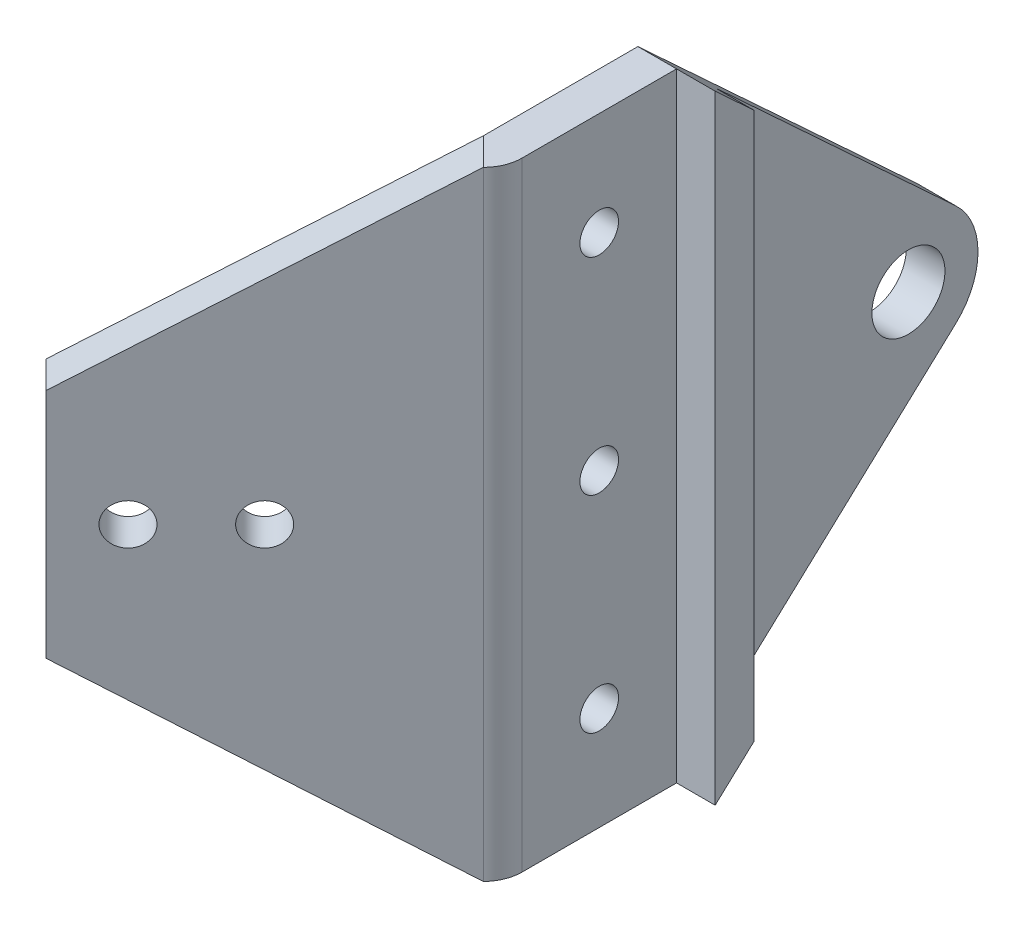
ISO-10303-21;
HEADER;
FILE_DESCRIPTION(('STEP AP214'),'2;1');
FILE_NAME('part.step','',(''),(''),'','','');
FILE_SCHEMA(('AUTOMOTIVE_DESIGN { 1 0 10303 214 1 1 1 1 }'));
ENDSEC;
DATA;
#1=APPLICATION_CONTEXT('core data for automotive mechanical design processes');
#2=APPLICATION_PROTOCOL_DEFINITION('international standard','automotive_design',2000,#1);
#3=PRODUCT_CONTEXT('',#1,'mechanical');
#4=PRODUCT('Part','Part','',(#3));
#5=PRODUCT_RELATED_PRODUCT_CATEGORY('part','',(#4));
#6=PRODUCT_DEFINITION_FORMATION('','',#4);
#7=PRODUCT_DEFINITION_CONTEXT('part definition',#1,'design');
#8=PRODUCT_DEFINITION('design','',#6,#7);
#9=PRODUCT_DEFINITION_SHAPE('','',#8);
#10=(LENGTH_UNIT() NAMED_UNIT(*) SI_UNIT(.MILLI.,.METRE.));
#11=(NAMED_UNIT(*) PLANE_ANGLE_UNIT() SI_UNIT($,.RADIAN.));
#12=(NAMED_UNIT(*) SI_UNIT($,.STERADIAN.) SOLID_ANGLE_UNIT());
#13=UNCERTAINTY_MEASURE_WITH_UNIT(LENGTH_MEASURE(1.E-05),#10,'distance_accuracy_value','');
#14=(GEOMETRIC_REPRESENTATION_CONTEXT(3) GLOBAL_UNCERTAINTY_ASSIGNED_CONTEXT((#13)) GLOBAL_UNIT_ASSIGNED_CONTEXT((#10,
#11,#12)) REPRESENTATION_CONTEXT('',''));
#15=CARTESIAN_POINT('',(0.,0.,0.));
#16=DIRECTION('',(0.,0.,1.));
#17=DIRECTION('',(1.,0.,0.));
#18=AXIS2_PLACEMENT_3D('',#15,#16,#17);
#19=CARTESIAN_POINT('',(6.35,45.6964355111143,0.));
#20=DIRECTION('',(0.,1.,0.));
#21=DIRECTION('',(0.,0.,1.));
#22=AXIS2_PLACEMENT_3D('',#19,#20,#21);
#23=PLANE('',#22);
#24=DIRECTION('',(-0.70710678118655,0.,-0.707106781186545));
#25=VECTOR('',#24,1.);
#26=CARTESIAN_POINT('',(26.5555762724059,45.6964355111151,-1304.32184699191));
#27=LINE('',#26,#25);
#28=CARTESIAN_POINT('',(4.49012806053468,45.6964355111151,-1326.38729520378));
#29=VERTEX_POINT('',#28);
#30=CARTESIAN_POINT('',(8.53483950180589E-13,45.6964355111151,-1330.87742326432));
#31=VERTEX_POINT('',#30);
#32=EDGE_CURVE('E364',#29,#31,#27,.T.);
#33=ORIENTED_EDGE('',*,*,#32,.T.);
#34=DIRECTION('',(0.,0.,-1.));
#35=VECTOR('',#34,1.);
#36=CARTESIAN_POINT('',(0.,45.6964355111143,0.));
#37=LINE('',#36,#35);
#38=CARTESIAN_POINT('',(0.,45.6964355111151,-1356.27742326432));
#39=VERTEX_POINT('',#38);
#40=EDGE_CURVE('E289',#31,#39,#37,.T.);
#41=ORIENTED_EDGE('',*,*,#40,.T.);
#42=DIRECTION('',(-1.,0.,0.));
#43=VECTOR('',#42,1.);
#44=CARTESIAN_POINT('',(6.35,45.6964355111151,-1356.27742326432));
#45=LINE('',#44,#43);
#46=CARTESIAN_POINT('',(6.35,45.6964355111151,-1356.27742326432));
#47=VERTEX_POINT('',#46);
#48=EDGE_CURVE('E280',#47,#39,#45,.T.);
#49=ORIENTED_EDGE('',*,*,#48,.F.);
#50=DIRECTION('',(0.,0.,-1.));
#51=VECTOR('',#50,1.);
#52=CARTESIAN_POINT('',(6.35,45.6964355111143,0.));
#53=LINE('',#52,#51);
#54=CARTESIAN_POINT('',(6.35,45.6964355111151,-1330.87742326432));
#55=VERTEX_POINT('',#54);
#56=EDGE_CURVE('E224',#55,#47,#53,.T.);
#57=ORIENTED_EDGE('',*,*,#56,.F.);
#58=CARTESIAN_POINT('',(0.,45.6964355111151,-1330.87742326432));
#59=DIRECTION('',(0.,-1.,0.));
#60=DIRECTION('',(0.,0.,-1.));
#61=AXIS2_PLACEMENT_3D('',#58,#59,#60);
#62=CIRCLE('',#61,6.35000000000012);
#63=EDGE_CURVE('E172',#29,#55,#62,.F.);
#64=ORIENTED_EDGE('',*,*,#63,.F.);
#65=EDGE_LOOP('',(#33,#41,#49,#57,#64));
#66=FACE_BOUND('',#65,.T.);
#67=ADVANCED_FACE('F44',(#66),#23,.F.);
#68=CARTESIAN_POINT('',(-660.948583571624,205.776353097841,-660.948583571615));
#69=DIRECTION('',(-0.707106781186552,0.,-0.707106781186543));
#70=DIRECTION('',(-0.707106781186543,0.,0.707106781186552));
#71=AXIS2_PLACEMENT_3D('',#68,#69,#70);
#72=PLANE('',#71);
#73=CARTESIAN_POINT('',(-24.6957043329401,96.4964355111151,-1297.20146281031));
#74=DIRECTION('',(-0.707106781186552,0.,-0.707106781186543));
#75=DIRECTION('',(-0.707106781186543,0.,0.707106781186552));
#76=AXIS2_PLACEMENT_3D('',#73,#74,#75);
#77=CIRCLE('',#76,3.37343750000004);
#78=CARTESIAN_POINT('',(-27.0810848650991,96.4964355111151,-1294.81608227815));
#79=VERTEX_POINT('',#78);
#80=EDGE_CURVE('E371',#79,#79,#77,.T.);
#81=ORIENTED_EDGE('',*,*,#80,.T.);
#82=EDGE_LOOP('',(#81));
#83=FACE_BOUND('',#82,.T.);
#84=CARTESIAN_POINT('',(-13.4703841816039,96.4964355111151,-1308.42678296164));
#85=DIRECTION('',(-0.707106781186552,0.,-0.707106781186543));
#86=DIRECTION('',(-0.707106781186543,0.,0.707106781186552));
#87=AXIS2_PLACEMENT_3D('',#84,#85,#86);
#88=CIRCLE('',#87,3.37343749999989);
#89=CARTESIAN_POINT('',(-15.8557647137628,96.4964355111151,-1306.04140242948));
#90=VERTEX_POINT('',#89);
#91=EDGE_CURVE('E377',#90,#90,#88,.T.);
#92=ORIENTED_EDGE('',*,*,#91,.T.);
#93=EDGE_LOOP('',(#92));
#94=FACE_BOUND('',#93,.T.);
#95=DIRECTION('',(0.,-1.,0.));
#96=VECTOR('',#95,1.);
#97=CARTESIAN_POINT('',(4.49012806053439,205.776353097842,-1326.38729520378));
#98=LINE('',#97,#96);
#99=CARTESIAN_POINT('',(4.49012806053454,147.296435511115,-1326.38729520378));
#100=VERTEX_POINT('',#99);
#101=EDGE_CURVE('E169',#100,#29,#98,.T.);
#102=ORIENTED_EDGE('',*,*,#101,.F.);
#103=DIRECTION('',(-0.599625351196684,-0.529998940003184,0.599625351196691));
#104=VECTOR('',#103,1.);
#105=CARTESIAN_POINT('',(-455.442632533912,-259.230531871619,-866.45453460933));
#106=LINE('',#105,#104);
#107=CARTESIAN_POINT('',(-31.4308964237424,115.546435511115,-1290.46627071951));
#108=VERTEX_POINT('',#107);
#109=EDGE_CURVE('E357',#100,#108,#106,.T.);
#110=ORIENTED_EDGE('',*,*,#109,.T.);
#111=DIRECTION('',(0.,-1.,0.));
#112=VECTOR('',#111,1.);
#113=CARTESIAN_POINT('',(-31.430896423742,205.776353097842,-1290.46627071951));
#114=LINE('',#113,#112);
#115=CARTESIAN_POINT('',(-31.4308964237423,77.4464355111149,-1290.46627071951));
#116=VERTEX_POINT('',#115);
#117=EDGE_CURVE('E155',#108,#116,#114,.T.);
#118=ORIENTED_EDGE('',*,*,#117,.T.);
#119=DIRECTION('',(-0.599625351196684,0.529998940003183,0.599625351196692));
#120=VECTOR('',#119,1.);
#121=CARTESIAN_POINT('',(-524.901123116457,513.616615021223,-796.996044026784));
#122=LINE('',#121,#120);
#123=EDGE_CURVE('E157',#29,#116,#122,.T.);
#124=ORIENTED_EDGE('',*,*,#123,.F.);
#125=EDGE_LOOP('',(#102,#110,#118,#124));
#126=FACE_BOUND('',#125,.T.);
#127=ADVANCED_FACE('F250',(#83,#94,#126),#72,.F.);
#128=CARTESIAN_POINT('',(629.517687147884,205.776353097841,-629.517687147967));
#129=DIRECTION('',(0.7071067811865,0.,-0.707106781186595));
#130=DIRECTION('',(-0.707106781186595,0.,-0.7071067811865));
#131=AXIS2_PLACEMENT_3D('',#128,#129,#130);
#132=PLANE('',#131);
#133=ORIENTED_EDGE('',*,*,#117,.F.);
#134=DIRECTION('',(-0.70710678118655,0.,-0.707106781186545));
#135=VECTOR('',#134,1.);
#136=CARTESIAN_POINT('',(-9.36544821187094,115.546435511115,-1268.40082250763));
#137=LINE('',#136,#135);
#138=CARTESIAN_POINT('',(-35.9210244842759,115.546435511115,-1294.95639878004));
#139=VERTEX_POINT('',#138);
#140=EDGE_CURVE('E139',#108,#139,#137,.T.);
#141=ORIENTED_EDGE('',*,*,#140,.T.);
#142=DIRECTION('',(0.,-1.,0.));
#143=VECTOR('',#142,1.);
#144=CARTESIAN_POINT('',(-35.9210244842767,205.776353097842,-1294.95639878004));
#145=LINE('',#144,#143);
#146=CARTESIAN_POINT('',(-35.9210244842767,77.4464355111149,-1294.95639878004));
#147=VERTEX_POINT('',#146);
#148=EDGE_CURVE('E153',#139,#147,#145,.T.);
#149=ORIENTED_EDGE('',*,*,#148,.T.);
#150=DIRECTION('',(-0.70710678118655,0.,-0.707106781186545));
#151=VECTOR('',#150,1.);
#152=CARTESIAN_POINT('',(-9.36544821187095,77.4464355111149,-1268.40082250763));
#153=LINE('',#152,#151);
#154=EDGE_CURVE('E62',#116,#147,#153,.T.);
#155=ORIENTED_EDGE('',*,*,#154,.F.);
#156=EDGE_LOOP('',(#133,#141,#149,#155));
#157=FACE_BOUND('',#156,.T.);
#158=ADVANCED_FACE('F152',(#157),#132,.F.);
#159=CARTESIAN_POINT('',(-665.438711632159,205.776353097841,-665.438711632151));
#160=DIRECTION('',(0.707106781186551,0.,0.707106781186544));
#161=DIRECTION('',(0.707106781186544,0.,-0.707106781186551));
#162=AXIS2_PLACEMENT_3D('',#159,#160,#161);
#163=PLANE('',#162);
#164=CARTESIAN_POINT('',(-29.1858323934746,96.4964355111151,-1301.69159087084));
#165=DIRECTION('',(-0.707106781186551,0.,-0.707106781186544));
#166=DIRECTION('',(-0.707106781186544,0.,0.707106781186551));
#167=AXIS2_PLACEMENT_3D('',#164,#165,#166);
#168=CIRCLE('',#167,3.37343750000004);
#169=CARTESIAN_POINT('',(-31.5712129256336,96.4964355111151,-1299.30621033868));
#170=VERTEX_POINT('',#169);
#171=EDGE_CURVE('E385',#170,#170,#168,.T.);
#172=ORIENTED_EDGE('',*,*,#171,.F.);
#173=EDGE_LOOP('',(#172));
#174=FACE_BOUND('',#173,.T.);
#175=CARTESIAN_POINT('',(-17.9605122421383,96.4964355111151,-1312.91691102218));
#176=DIRECTION('',(-0.707106781186551,0.,-0.707106781186544));
#177=DIRECTION('',(-0.707106781186544,0.,0.707106781186551));
#178=AXIS2_PLACEMENT_3D('',#175,#176,#177);
#179=CIRCLE('',#178,3.37343749999989);
#180=CARTESIAN_POINT('',(-20.3458927742972,96.4964355111151,-1310.53153049002));
#181=VERTEX_POINT('',#180);
#182=EDGE_CURVE('E381',#181,#181,#179,.T.);
#183=ORIENTED_EDGE('',*,*,#182,.F.);
#184=EDGE_LOOP('',(#183));
#185=FACE_BOUND('',#184,.T.);
#186=ORIENTED_EDGE('',*,*,#148,.F.);
#187=DIRECTION('',(-0.599625351196686,-0.529998940003184,0.599625351196689));
#188=VECTOR('',#187,1.);
#189=CARTESIAN_POINT('',(-525.328650339758,-317.032878247416,-805.548772924554));
#190=LINE('',#189,#188);
#191=CARTESIAN_POINT('',(0.,147.296435511115,-1330.87742326432));
#192=VERTEX_POINT('',#191);
#193=EDGE_CURVE('E136',#192,#139,#190,.T.);
#194=ORIENTED_EDGE('',*,*,#193,.F.);
#195=DIRECTION('',(0.,-1.,0.));
#196=VECTOR('',#195,1.);
#197=CARTESIAN_POINT('',(0.,0.,-1330.87742326432));
#198=LINE('',#197,#196);
#199=EDGE_CURVE('E285',#192,#31,#198,.T.);
#200=ORIENTED_EDGE('',*,*,#199,.T.);
#201=DIRECTION('',(-0.599625351196686,0.529998940003183,0.59962535119669));
#202=VECTOR('',#201,1.);
#203=CARTESIAN_POINT('',(-463.995361431679,455.814268645423,-866.882061832634));
#204=LINE('',#203,#202);
#205=EDGE_CURVE('E160',#31,#147,#204,.T.);
#206=ORIENTED_EDGE('',*,*,#205,.T.);
#207=EDGE_LOOP('',(#186,#194,#200,#206));
#208=FACE_BOUND('',#207,.T.);
#209=ADVANCED_FACE('F159',(#174,#185,#208),#163,.F.);
#210=CARTESIAN_POINT('',(6.35,0.,0.));
#211=DIRECTION('',(1.,0.,0.));
#212=DIRECTION('',(0.,0.,-1.));
#213=AXIS2_PLACEMENT_3D('',#210,#211,#212);
#214=PLANE('',#213);
#215=CARTESIAN_POINT('',(6.35,62.6297688444484,-1343.57742326432));
#216=DIRECTION('',(1.,0.,0.));
#217=DIRECTION('',(0.,0.,-1.));
#218=AXIS2_PLACEMENT_3D('',#215,#216,#217);
#219=CIRCLE('',#218,3.17499999999986);
#220=CARTESIAN_POINT('',(6.35,62.6297688444484,-1346.75242326432));
#221=VERTEX_POINT('',#220);
#222=EDGE_CURVE('E319',#221,#221,#219,.F.);
#223=ORIENTED_EDGE('',*,*,#222,.T.);
#224=EDGE_LOOP('',(#223));
#225=FACE_BOUND('',#224,.T.);
#226=CARTESIAN_POINT('',(6.35,130.363102177782,-1343.57742326432));
#227=DIRECTION('',(1.,0.,0.));
#228=DIRECTION('',(0.,0.,-1.));
#229=AXIS2_PLACEMENT_3D('',#226,#227,#228);
#230=CIRCLE('',#229,3.17499999999986);
#231=CARTESIAN_POINT('',(6.35,130.363102177782,-1346.75242326432));
#232=VERTEX_POINT('',#231);
#233=EDGE_CURVE('E333',#232,#232,#230,.T.);
#234=ORIENTED_EDGE('',*,*,#233,.F.);
#235=EDGE_LOOP('',(#234));
#236=FACE_BOUND('',#235,.T.);
#237=CARTESIAN_POINT('',(6.35,96.4964355111151,-1343.57742326432));
#238=DIRECTION('',(1.,0.,0.));
#239=DIRECTION('',(0.,0.,-1.));
#240=AXIS2_PLACEMENT_3D('',#237,#238,#239);
#241=CIRCLE('',#240,3.17499999999986);
#242=CARTESIAN_POINT('',(6.35,96.4964355111151,-1346.75242326432));
#243=VERTEX_POINT('',#242);
#244=EDGE_CURVE('E233',#243,#243,#241,.T.);
#245=ORIENTED_EDGE('',*,*,#244,.F.);
#246=EDGE_LOOP('',(#245));
#247=FACE_BOUND('',#246,.T.);
#248=ORIENTED_EDGE('',*,*,#56,.T.);
#249=DIRECTION('',(0.,1.,0.));
#250=VECTOR('',#249,1.);
#251=CARTESIAN_POINT('',(6.35,0.,-1356.27742326432));
#252=LINE('',#251,#250);
#253=CARTESIAN_POINT('',(6.35,147.296435511115,-1356.27742326432));
#254=VERTEX_POINT('',#253);
#255=EDGE_CURVE('E205',#47,#254,#252,.T.);
#256=ORIENTED_EDGE('',*,*,#255,.T.);
#257=DIRECTION('',(0.,0.,1.));
#258=VECTOR('',#257,1.);
#259=CARTESIAN_POINT('',(6.35,147.296435511115,0.));
#260=LINE('',#259,#258);
#261=CARTESIAN_POINT('',(6.35,147.296435511115,-1330.87742326432));
#262=VERTEX_POINT('',#261);
#263=EDGE_CURVE('E218',#254,#262,#260,.T.);
#264=ORIENTED_EDGE('',*,*,#263,.T.);
#265=DIRECTION('',(0.,-1.,0.));
#266=VECTOR('',#265,1.);
#267=CARTESIAN_POINT('',(6.35,0.,-1330.87742326432));
#268=LINE('',#267,#266);
#269=EDGE_CURVE('E221',#262,#55,#268,.T.);
#270=ORIENTED_EDGE('',*,*,#269,.T.);
#271=EDGE_LOOP('',(#248,#256,#264,#270));
#272=FACE_BOUND('',#271,.T.);
#273=ADVANCED_FACE('F262',(#225,#236,#247,#272),#214,.T.);
#274=CARTESIAN_POINT('',(6.35,96.4964355111151,-1394.37742326432));
#275=DIRECTION('',(-1.,0.,0.));
#276=DIRECTION('',(0.,0.,1.));
#277=AXIS2_PLACEMENT_3D('',#274,#275,#276);
#278=CYLINDRICAL_SURFACE('',#277,11.4300000000001);
#279=CARTESIAN_POINT('',(0.,96.4964355111151,-1394.37742326432));
#280=DIRECTION('',(1.,0.,0.));
#281=DIRECTION('',(0.,0.,-1.));
#282=AXIS2_PLACEMENT_3D('',#279,#280,#281);
#283=CIRCLE('',#282,11.4300000000001);
#284=CARTESIAN_POINT('',(0.,88.1045298984414,-1402.13763074788));
#285=VERTEX_POINT('',#284);
#286=CARTESIAN_POINT('',(0.,104.888341123789,-1402.13763074788));
#287=VERTEX_POINT('',#286);
#288=EDGE_CURVE('E211',#285,#287,#283,.T.);
#289=ORIENTED_EDGE('',*,*,#288,.T.);
#290=DIRECTION('',(-1.,0.,0.));
#291=VECTOR('',#290,1.);
#292=CARTESIAN_POINT('',(6.35,104.888341123789,-1402.13763074788));
#293=LINE('',#292,#291);
#294=CARTESIAN_POINT('',(6.35,104.888341123789,-1402.13763074788));
#295=VERTEX_POINT('',#294);
#296=EDGE_CURVE('E12',#295,#287,#293,.T.);
#297=ORIENTED_EDGE('',*,*,#296,.F.);
#298=CARTESIAN_POINT('',(6.35,96.4964355111151,-1394.37742326432));
#299=DIRECTION('',(1.,0.,0.));
#300=DIRECTION('',(0.,0.,-1.));
#301=AXIS2_PLACEMENT_3D('',#298,#299,#300);
#302=CIRCLE('',#301,11.4300000000001);
#303=CARTESIAN_POINT('',(6.35,88.1045298984414,-1402.13763074788));
#304=VERTEX_POINT('',#303);
#305=EDGE_CURVE('E212',#304,#295,#302,.T.);
#306=ORIENTED_EDGE('',*,*,#305,.F.);
#307=DIRECTION('',(-1.,0.,0.));
#308=VECTOR('',#307,1.);
#309=CARTESIAN_POINT('',(6.35,88.1045298984414,-1402.13763074788));
#310=LINE('',#309,#308);
#311=EDGE_CURVE('E315',#304,#285,#310,.T.);
#312=ORIENTED_EDGE('',*,*,#311,.T.);
#313=EDGE_LOOP('',(#289,#297,#306,#312));
#314=FACE_BOUND('',#313,.T.);
#315=ADVANCED_FACE('F46',(#314),#278,.T.);
#316=CARTESIAN_POINT('',(6.35,755.467484096882,-698.599900221084));
#317=DIRECTION('',(0.,-0.73419996611318,0.678933288150909));
#318=DIRECTION('',(0.,-0.678933288150909,-0.73419996611318));
#319=AXIS2_PLACEMENT_3D('',#316,#317,#318);
#320=PLANE('',#319);
#321=DIRECTION('',(0.,0.678933288150909,0.73419996611318));
#322=VECTOR('',#321,1.);
#323=CARTESIAN_POINT('',(0.,755.467484096882,-698.599900221084));
#324=LINE('',#323,#322);
#325=CARTESIAN_POINT('',(0.,147.296435511115,-1356.27742326432));
#326=VERTEX_POINT('',#325);
#327=EDGE_CURVE('E265',#287,#326,#324,.T.);
#328=ORIENTED_EDGE('',*,*,#327,.T.);
#329=DIRECTION('',(-1.,0.,0.));
#330=VECTOR('',#329,1.);
#331=CARTESIAN_POINT('',(6.35,147.296435511115,-1356.27742326432));
#332=LINE('',#331,#330);
#333=EDGE_CURVE('E55',#254,#326,#332,.T.);
#334=ORIENTED_EDGE('',*,*,#333,.F.);
#335=DIRECTION('',(-1.,0.,0.));
#336=VECTOR('',#335,1.);
#337=CARTESIAN_POINT('',(12.7,147.296435511115,-1356.27742326432));
#338=LINE('',#337,#336);
#339=CARTESIAN_POINT('',(12.7,147.296435511115,-1356.27742326432));
#340=VERTEX_POINT('',#339);
#341=EDGE_CURVE('E197',#340,#254,#338,.T.);
#342=ORIENTED_EDGE('',*,*,#341,.F.);
#343=DIRECTION('',(0.,0.678933288150909,0.73419996611318));
#344=VECTOR('',#343,1.);
#345=CARTESIAN_POINT('',(12.7,755.467484096882,-698.599900221084));
#346=LINE('',#345,#344);
#347=CARTESIAN_POINT('',(12.7,141.424429819557,-1362.62742326432));
#348=VERTEX_POINT('',#347);
#349=EDGE_CURVE('E180',#348,#340,#346,.T.);
#350=ORIENTED_EDGE('',*,*,#349,.F.);
#351=DIRECTION('',(-1.,0.,0.));
#352=VECTOR('',#351,1.);
#353=CARTESIAN_POINT('',(12.7,141.424429819557,-1362.62742326432));
#354=LINE('',#353,#352);
#355=CARTESIAN_POINT('',(6.35,141.424429819557,-1362.62742326432));
#356=VERTEX_POINT('',#355);
#357=EDGE_CURVE('E201',#348,#356,#354,.T.);
#358=ORIENTED_EDGE('',*,*,#357,.T.);
#359=DIRECTION('',(0.,0.678933288150909,0.73419996611318));
#360=VECTOR('',#359,1.);
#361=CARTESIAN_POINT('',(6.35,755.467484096882,-698.599900221084));
#362=LINE('',#361,#360);
#363=EDGE_CURVE('E70',#295,#356,#362,.T.);
#364=ORIENTED_EDGE('',*,*,#363,.F.);
#365=ORIENTED_EDGE('',*,*,#296,.T.);
#366=EDGE_LOOP('',(#328,#334,#342,#350,#358,#364,#365));
#367=FACE_BOUND('',#366,.T.);
#368=ADVANCED_FACE('F255',(#367),#320,.F.);
#369=CARTESIAN_POINT('',(6.35,147.296435511115,0.));
#370=DIRECTION('',(0.,-1.,0.));
#371=DIRECTION('',(0.,0.,-1.));
#372=AXIS2_PLACEMENT_3D('',#369,#370,#371);
#373=PLANE('',#372);
#374=DIRECTION('',(0.,0.,1.));
#375=VECTOR('',#374,1.);
#376=CARTESIAN_POINT('',(0.,147.296435511115,0.));
#377=LINE('',#376,#375);
#378=EDGE_CURVE('E275',#326,#192,#377,.T.);
#379=ORIENTED_EDGE('',*,*,#378,.T.);
#380=DIRECTION('',(-0.70710678118655,0.,-0.707106781186545));
#381=VECTOR('',#380,1.);
#382=CARTESIAN_POINT('',(26.5555762724057,147.296435511115,-1304.32184699191));
#383=LINE('',#382,#381);
#384=EDGE_CURVE('E142',#100,#192,#383,.T.);
#385=ORIENTED_EDGE('',*,*,#384,.F.);
#386=CARTESIAN_POINT('',(0.,147.296435511115,-1330.87742326432));
#387=DIRECTION('',(0.,-1.,0.));
#388=DIRECTION('',(0.,0.,-1.));
#389=AXIS2_PLACEMENT_3D('',#386,#387,#388);
#390=CIRCLE('',#389,6.35000000000012);
#391=EDGE_CURVE('E162',#262,#100,#390,.T.);
#392=ORIENTED_EDGE('',*,*,#391,.F.);
#393=ORIENTED_EDGE('',*,*,#263,.F.);
#394=ORIENTED_EDGE('',*,*,#333,.T.);
#395=EDGE_LOOP('',(#379,#385,#392,#393,#394));
#396=FACE_BOUND('',#395,.T.);
#397=ADVANCED_FACE('F252',(#396),#373,.F.);
#398=CARTESIAN_POINT('',(6.35,130.363102177782,-1343.57742326432));
#399=DIRECTION('',(-1.,0.,0.));
#400=DIRECTION('',(0.,0.,1.));
#401=AXIS2_PLACEMENT_3D('',#398,#399,#400);
#402=CYLINDRICAL_SURFACE('',#401,3.17499999999986);
#403=ORIENTED_EDGE('',*,*,#233,.T.);
#404=EDGE_LOOP('',(#403));
#405=FACE_BOUND('',#404,.T.);
#406=CARTESIAN_POINT('',(0.,130.363102177782,-1343.57742326432));
#407=DIRECTION('',(1.,0.,0.));
#408=DIRECTION('',(0.,0.,-1.));
#409=AXIS2_PLACEMENT_3D('',#406,#407,#408);
#410=CIRCLE('',#409,3.17499999999986);
#411=CARTESIAN_POINT('',(0.,130.363102177782,-1346.75242326432));
#412=VERTEX_POINT('',#411);
#413=EDGE_CURVE('E308',#412,#412,#410,.T.);
#414=ORIENTED_EDGE('',*,*,#413,.F.);
#415=EDGE_LOOP('',(#414));
#416=FACE_BOUND('',#415,.T.);
#417=ADVANCED_FACE('F254',(#405,#416),#402,.F.);
#418=CARTESIAN_POINT('',(6.35,96.4964355111151,-1343.57742326432));
#419=DIRECTION('',(-1.,0.,0.));
#420=DIRECTION('',(0.,0.,1.));
#421=AXIS2_PLACEMENT_3D('',#418,#419,#420);
#422=CYLINDRICAL_SURFACE('',#421,3.17499999999986);
#423=ORIENTED_EDGE('',*,*,#244,.T.);
#424=EDGE_LOOP('',(#423));
#425=FACE_BOUND('',#424,.T.);
#426=CARTESIAN_POINT('',(0.,96.4964355111151,-1343.57742326432));
#427=DIRECTION('',(1.,0.,0.));
#428=DIRECTION('',(0.,0.,-1.));
#429=AXIS2_PLACEMENT_3D('',#426,#427,#428);
#430=CIRCLE('',#429,3.17499999999986);
#431=CARTESIAN_POINT('',(0.,96.4964355111151,-1346.75242326432));
#432=VERTEX_POINT('',#431);
#433=EDGE_CURVE('E304',#432,#432,#430,.T.);
#434=ORIENTED_EDGE('',*,*,#433,.F.);
#435=EDGE_LOOP('',(#434));
#436=FACE_BOUND('',#435,.T.);
#437=ADVANCED_FACE('F241',(#425,#436),#422,.F.);
#438=CARTESIAN_POINT('',(6.35,96.4964355111151,-1394.37742326432));
#439=DIRECTION('',(1.,0.,0.));
#440=DIRECTION('',(0.,0.,1.));
#441=AXIS2_PLACEMENT_3D('',#438,#439,#440);
#442=ELLIPSE('',#441,6.00000000000001,5.99977153838503);
#443=DIRECTION('',(-1.,0.,0.));
#444=VECTOR('',#443,1.);
#445=SURFACE_OF_LINEAR_EXTRUSION('',#442,#444);
#446=CARTESIAN_POINT('',(6.35,96.496435511115,-1388.37742326432));
#447=VERTEX_POINT('',#446);
#448=EDGE_CURVE('E228',#447,#447,#442,.T.);
#449=ORIENTED_EDGE('',*,*,#448,.T.);
#450=EDGE_LOOP('',(#449));
#451=FACE_BOUND('',#450,.T.);
#452=CARTESIAN_POINT('',(0.,96.4964355111151,-1394.37742326432));
#453=DIRECTION('',(1.,0.,0.));
#454=DIRECTION('',(0.,0.,1.));
#455=AXIS2_PLACEMENT_3D('',#452,#453,#454);
#456=ELLIPSE('',#455,6.00000000000001,5.99977153838503);
#457=CARTESIAN_POINT('',(0.,96.496435511115,-1388.37742326432));
#458=VERTEX_POINT('',#457);
#459=EDGE_CURVE('E298',#458,#458,#456,.T.);
#460=ORIENTED_EDGE('',*,*,#459,.F.);
#461=EDGE_LOOP('',(#460));
#462=FACE_BOUND('',#461,.T.);
#463=ADVANCED_FACE('F236',(#451,#462),#445,.T.);
#464=CARTESIAN_POINT('',(6.35,-651.434756052993,-602.398203971947));
#465=DIRECTION('',(0.,0.73419996611318,0.678933288150909));
#466=DIRECTION('',(0.,-0.678933288150909,0.73419996611318));
#467=AXIS2_PLACEMENT_3D('',#464,#465,#466);
#468=PLANE('',#467);
#469=DIRECTION('',(0.,0.678933288150909,-0.73419996611318));
#470=VECTOR('',#469,1.);
#471=CARTESIAN_POINT('',(6.35,-651.434756052993,-602.398203971947));
#472=LINE('',#471,#470);
#473=CARTESIAN_POINT('',(6.35,51.568441202673,-1362.62742326432));
#474=VERTEX_POINT('',#473);
#475=EDGE_CURVE('E48',#474,#304,#472,.T.);
#476=ORIENTED_EDGE('',*,*,#475,.F.);
#477=DIRECTION('',(-1.,0.,0.));
#478=VECTOR('',#477,1.);
#479=CARTESIAN_POINT('',(12.7,51.568441202673,-1362.62742326432));
#480=LINE('',#479,#478);
#481=CARTESIAN_POINT('',(12.7,51.568441202673,-1362.62742326432));
#482=VERTEX_POINT('',#481);
#483=EDGE_CURVE('E189',#482,#474,#480,.T.);
#484=ORIENTED_EDGE('',*,*,#483,.F.);
#485=DIRECTION('',(0.,0.678933288150909,-0.73419996611318));
#486=VECTOR('',#485,1.);
#487=CARTESIAN_POINT('',(12.7,-651.434756052993,-602.398203971947));
#488=LINE('',#487,#486);
#489=CARTESIAN_POINT('',(12.7,45.6964355111151,-1356.27742326432));
#490=VERTEX_POINT('',#489);
#491=EDGE_CURVE('E186',#490,#482,#488,.T.);
#492=ORIENTED_EDGE('',*,*,#491,.F.);
#493=DIRECTION('',(-1.,0.,0.));
#494=VECTOR('',#493,1.);
#495=CARTESIAN_POINT('',(12.7,45.6964355111151,-1356.27742326432));
#496=LINE('',#495,#494);
#497=EDGE_CURVE('E193',#490,#47,#496,.T.);
#498=ORIENTED_EDGE('',*,*,#497,.T.);
#499=ORIENTED_EDGE('',*,*,#48,.T.);
#500=DIRECTION('',(0.,0.678933288150909,-0.73419996611318));
#501=VECTOR('',#500,1.);
#502=CARTESIAN_POINT('',(0.,-651.434756052993,-602.398203971947));
#503=LINE('',#502,#501);
#504=EDGE_CURVE('E295',#39,#285,#503,.T.);
#505=ORIENTED_EDGE('',*,*,#504,.T.);
#506=ORIENTED_EDGE('',*,*,#311,.F.);
#507=EDGE_LOOP('',(#476,#484,#492,#498,#499,#505,#506));
#508=FACE_BOUND('',#507,.T.);
#509=ADVANCED_FACE('F240',(#508),#468,.F.);
#510=CARTESIAN_POINT('',(6.35,62.6297688444484,-1343.57742326432));
#511=DIRECTION('',(-1.,0.,0.));
#512=DIRECTION('',(0.,0.,1.));
#513=AXIS2_PLACEMENT_3D('',#510,#511,#512);
#514=CYLINDRICAL_SURFACE('',#513,3.17499999999986);
#515=ORIENTED_EDGE('',*,*,#222,.F.);
#516=EDGE_LOOP('',(#515));
#517=FACE_BOUND('',#516,.T.);
#518=CARTESIAN_POINT('',(0.,62.6297688444484,-1343.57742326432));
#519=DIRECTION('',(1.,0.,0.));
#520=DIRECTION('',(0.,0.,-1.));
#521=AXIS2_PLACEMENT_3D('',#518,#519,#520);
#522=CIRCLE('',#521,3.17499999999986);
#523=CARTESIAN_POINT('',(0.,62.6297688444484,-1346.75242326432));
#524=VERTEX_POINT('',#523);
#525=EDGE_CURVE('E215',#524,#524,#522,.F.);
#526=ORIENTED_EDGE('',*,*,#525,.T.);
#527=EDGE_LOOP('',(#526));
#528=FACE_BOUND('',#527,.T.);
#529=ADVANCED_FACE('F246',(#517,#528),#514,.F.);
#530=DIRECTION('',(0.,1.,0.));
#531=VECTOR('',#530,1.);
#532=CARTESIAN_POINT('',(6.35,0.,-1362.62742326432));
#533=LINE('',#532,#531);
#534=EDGE_CURVE('E208',#474,#356,#533,.T.);
#535=ORIENTED_EDGE('',*,*,#534,.F.);
#536=ORIENTED_EDGE('',*,*,#475,.T.);
#537=ORIENTED_EDGE('',*,*,#305,.T.);
#538=ORIENTED_EDGE('',*,*,#363,.T.);
#539=EDGE_LOOP('',(#535,#536,#537,#538));
#540=FACE_BOUND('',#539,.T.);
#541=ORIENTED_EDGE('',*,*,#448,.F.);
#542=EDGE_LOOP('',(#541));
#543=FACE_BOUND('',#542,.T.);
#544=ADVANCED_FACE('F348',(#540,#543),#214,.T.);
#545=CARTESIAN_POINT('',(0.,0.,0.));
#546=DIRECTION('',(1.,0.,0.));
#547=DIRECTION('',(0.,0.,-1.));
#548=AXIS2_PLACEMENT_3D('',#545,#546,#547);
#549=PLANE('',#548);
#550=ORIENTED_EDGE('',*,*,#288,.F.);
#551=ORIENTED_EDGE('',*,*,#504,.F.);
#552=ORIENTED_EDGE('',*,*,#40,.F.);
#553=ORIENTED_EDGE('',*,*,#199,.F.);
#554=ORIENTED_EDGE('',*,*,#378,.F.);
#555=ORIENTED_EDGE('',*,*,#327,.F.);
#556=EDGE_LOOP('',(#550,#551,#552,#553,#554,#555));
#557=FACE_BOUND('',#556,.T.);
#558=ORIENTED_EDGE('',*,*,#459,.T.);
#559=EDGE_LOOP('',(#558));
#560=FACE_BOUND('',#559,.T.);
#561=ORIENTED_EDGE('',*,*,#525,.F.);
#562=EDGE_LOOP('',(#561));
#563=FACE_BOUND('',#562,.T.);
#564=ORIENTED_EDGE('',*,*,#413,.T.);
#565=EDGE_LOOP('',(#564));
#566=FACE_BOUND('',#565,.T.);
#567=ORIENTED_EDGE('',*,*,#433,.T.);
#568=EDGE_LOOP('',(#567));
#569=FACE_BOUND('',#568,.T.);
#570=ADVANCED_FACE('F282',(#557,#560,#563,#566,#569),#549,.F.);
#571=CARTESIAN_POINT('',(12.7,0.,-1362.62742326432));
#572=DIRECTION('',(0.,0.,-1.));
#573=DIRECTION('',(-1.,0.,0.));
#574=AXIS2_PLACEMENT_3D('',#571,#572,#573);
#575=PLANE('',#574);
#576=ORIENTED_EDGE('',*,*,#483,.T.);
#577=ORIENTED_EDGE('',*,*,#534,.T.);
#578=ORIENTED_EDGE('',*,*,#357,.F.);
#579=DIRECTION('',(0.,-1.,0.));
#580=VECTOR('',#579,1.);
#581=CARTESIAN_POINT('',(12.7,0.,-1362.62742326432));
#582=LINE('',#581,#580);
#583=EDGE_CURVE('E167',#348,#482,#582,.T.);
#584=ORIENTED_EDGE('',*,*,#583,.T.);
#585=EDGE_LOOP('',(#576,#577,#578,#584));
#586=FACE_BOUND('',#585,.T.);
#587=ADVANCED_FACE('F427',(#586),#575,.T.);
#588=CARTESIAN_POINT('',(12.7,0.,-1356.27742326432));
#589=DIRECTION('',(0.,0.,-1.));
#590=DIRECTION('',(-1.,0.,0.));
#591=AXIS2_PLACEMENT_3D('',#588,#589,#590);
#592=PLANE('',#591);
#593=ORIENTED_EDGE('',*,*,#255,.F.);
#594=ORIENTED_EDGE('',*,*,#497,.F.);
#595=DIRECTION('',(0.,-1.,0.));
#596=VECTOR('',#595,1.);
#597=CARTESIAN_POINT('',(12.7,0.,-1356.27742326432));
#598=LINE('',#597,#596);
#599=EDGE_CURVE('E183',#340,#490,#598,.T.);
#600=ORIENTED_EDGE('',*,*,#599,.F.);
#601=ORIENTED_EDGE('',*,*,#341,.T.);
#602=EDGE_LOOP('',(#593,#594,#600,#601));
#603=FACE_BOUND('',#602,.T.);
#604=ADVANCED_FACE('F423',(#603),#592,.F.);
#605=CARTESIAN_POINT('',(12.7,0.,0.));
#606=DIRECTION('',(1.,0.,0.));
#607=DIRECTION('',(0.,0.,-1.));
#608=AXIS2_PLACEMENT_3D('',#605,#606,#607);
#609=PLANE('',#608);
#610=ORIENTED_EDGE('',*,*,#583,.F.);
#611=ORIENTED_EDGE('',*,*,#349,.T.);
#612=ORIENTED_EDGE('',*,*,#599,.T.);
#613=ORIENTED_EDGE('',*,*,#491,.T.);
#614=EDGE_LOOP('',(#610,#611,#612,#613));
#615=FACE_BOUND('',#614,.T.);
#616=ADVANCED_FACE('F416',(#615),#609,.T.);
#617=CARTESIAN_POINT('',(0.,205.776353097842,-1330.87742326432));
#618=DIRECTION('',(0.,-1.,0.));
#619=DIRECTION('',(0.,0.,-1.));
#620=AXIS2_PLACEMENT_3D('',#617,#618,#619);
#621=CYLINDRICAL_SURFACE('',#620,6.35000000000012);
#622=ORIENTED_EDGE('',*,*,#269,.F.);
#623=ORIENTED_EDGE('',*,*,#391,.T.);
#624=ORIENTED_EDGE('',*,*,#101,.T.);
#625=ORIENTED_EDGE('',*,*,#63,.T.);
#626=EDGE_LOOP('',(#622,#623,#624,#625));
#627=FACE_BOUND('',#626,.T.);
#628=ADVANCED_FACE('F354',(#627),#621,.T.);
#629=CARTESIAN_POINT('',(-437.439785159274,455.814268645423,-840.326485560229));
#630=DIRECTION('',(-0.374765844497931,-0.847998304005086,0.374765844497934));
#631=DIRECTION('',(0.,-0.404226041727225,-0.914659120760045));
#632=AXIS2_PLACEMENT_3D('',#629,#630,#631);
#633=PLANE('',#632);
#634=ORIENTED_EDGE('',*,*,#123,.T.);
#635=ORIENTED_EDGE('',*,*,#154,.T.);
#636=ORIENTED_EDGE('',*,*,#205,.F.);
#637=ORIENTED_EDGE('',*,*,#32,.F.);
#638=EDGE_LOOP('',(#634,#635,#636,#637));
#639=FACE_BOUND('',#638,.T.);
#640=ADVANCED_FACE('F408',(#639),#633,.T.);
#641=CARTESIAN_POINT('',(-498.773074067353,-317.032878247416,-778.993196652149));
#642=DIRECTION('',(0.374765844497932,-0.847998304005085,-0.374765844497935));
#643=DIRECTION('',(0.,0.404226041727227,-0.914659120760045));
#644=AXIS2_PLACEMENT_3D('',#641,#642,#643);
#645=PLANE('',#644);
#646=ORIENTED_EDGE('',*,*,#384,.T.);
#647=ORIENTED_EDGE('',*,*,#193,.T.);
#648=ORIENTED_EDGE('',*,*,#140,.F.);
#649=ORIENTED_EDGE('',*,*,#109,.F.);
#650=EDGE_LOOP('',(#646,#647,#648,#649));
#651=FACE_BOUND('',#650,.T.);
#652=ADVANCED_FACE('F138',(#651),#645,.F.);
#653=CARTESIAN_POINT('',(8.59506403026735,96.4964355111151,-1286.36133474977));
#654=DIRECTION('',(-0.707106781186551,0.,-0.707106781186544));
#655=DIRECTION('',(-0.707106781186544,0.,0.707106781186551));
#656=AXIS2_PLACEMENT_3D('',#653,#654,#655);
#657=CYLINDRICAL_SURFACE('',#656,3.37343749999989);
#658=ORIENTED_EDGE('',*,*,#182,.T.);
#659=EDGE_LOOP('',(#658));
#660=FACE_BOUND('',#659,.T.);
#661=ORIENTED_EDGE('',*,*,#91,.F.);
#662=EDGE_LOOP('',(#661));
#663=FACE_BOUND('',#662,.T.);
#664=ADVANCED_FACE('F398',(#660,#663),#657,.F.);
#665=CARTESIAN_POINT('',(-2.63025612106892,96.4964355111151,-1275.13601459844));
#666=DIRECTION('',(-0.707106781186551,0.,-0.707106781186544));
#667=DIRECTION('',(-0.707106781186544,0.,0.707106781186551));
#668=AXIS2_PLACEMENT_3D('',#665,#666,#667);
#669=CYLINDRICAL_SURFACE('',#668,3.37343750000004);
#670=ORIENTED_EDGE('',*,*,#171,.T.);
#671=EDGE_LOOP('',(#670));
#672=FACE_BOUND('',#671,.T.);
#673=ORIENTED_EDGE('',*,*,#80,.F.);
#674=EDGE_LOOP('',(#673));
#675=FACE_BOUND('',#674,.T.);
#676=ADVANCED_FACE('F390',(#672,#675),#669,.F.);
#677=CLOSED_SHELL('',(#67,#127,#158,#209,#273,#315,#368,#397,#417,#437,#463,#509,#529,#544,#570,
#587,#604,#616,#628,#640,#652,#664,#676));
#678=MANIFOLD_SOLID_BREP('B2',#677);
#679=ADVANCED_BREP_SHAPE_REPRESENTATION('',(#18,#678),#14);
#680=SHAPE_DEFINITION_REPRESENTATION(#9,#679);
ENDSEC;
END-ISO-10303-21;
